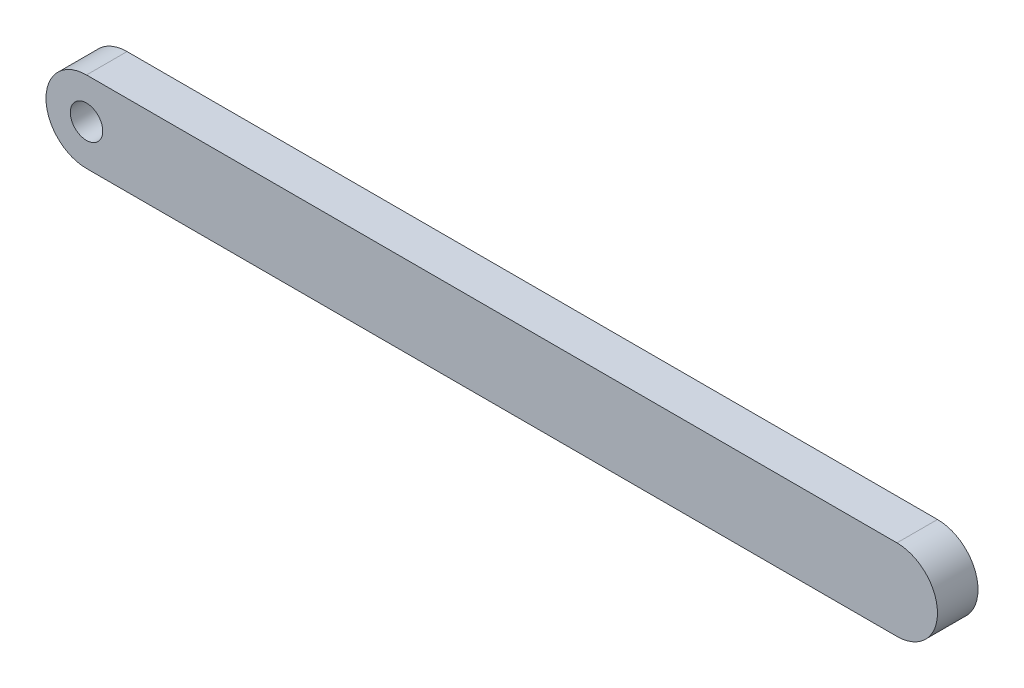
ISO-10303-21;
HEADER;
FILE_DESCRIPTION(('STEP AP214'),'2;1');
FILE_NAME('part.step','',(''),(''),'','','');
FILE_SCHEMA(('AUTOMOTIVE_DESIGN { 1 0 10303 214 1 1 1 1 }'));
ENDSEC;
DATA;
#1=APPLICATION_CONTEXT('core data for automotive mechanical design processes');
#2=APPLICATION_PROTOCOL_DEFINITION('international standard','automotive_design',2000,#1);
#3=PRODUCT_CONTEXT('',#1,'mechanical');
#4=PRODUCT('Part','Part','',(#3));
#5=PRODUCT_RELATED_PRODUCT_CATEGORY('part','',(#4));
#6=PRODUCT_DEFINITION_FORMATION('','',#4);
#7=PRODUCT_DEFINITION_CONTEXT('part definition',#1,'design');
#8=PRODUCT_DEFINITION('design','',#6,#7);
#9=PRODUCT_DEFINITION_SHAPE('','',#8);
#10=(LENGTH_UNIT() NAMED_UNIT(*) SI_UNIT(.MILLI.,.METRE.));
#11=(NAMED_UNIT(*) PLANE_ANGLE_UNIT() SI_UNIT($,.RADIAN.));
#12=(NAMED_UNIT(*) SI_UNIT($,.STERADIAN.) SOLID_ANGLE_UNIT());
#13=UNCERTAINTY_MEASURE_WITH_UNIT(LENGTH_MEASURE(1.E-05),#10,'distance_accuracy_value','');
#14=(GEOMETRIC_REPRESENTATION_CONTEXT(3) GLOBAL_UNCERTAINTY_ASSIGNED_CONTEXT((#13)) GLOBAL_UNIT_ASSIGNED_CONTEXT((#10,
#11,#12)) REPRESENTATION_CONTEXT('',''));
#15=CARTESIAN_POINT('',(0.,0.,0.));
#16=DIRECTION('',(0.,0.,1.));
#17=DIRECTION('',(1.,0.,0.));
#18=AXIS2_PLACEMENT_3D('',#15,#16,#17);
#19=CARTESIAN_POINT('',(0.,-5.00000000000002,5.));
#20=DIRECTION('',(0.,0.,-1.));
#21=DIRECTION('',(-1.,0.,0.));
#22=AXIS2_PLACEMENT_3D('',#19,#20,#21);
#23=CYLINDRICAL_SURFACE('',#22,5.);
#24=CARTESIAN_POINT('',(0.,-5.00000000000002,0.));
#25=DIRECTION('',(0.,0.,1.));
#26=DIRECTION('',(1.,0.,0.));
#27=AXIS2_PLACEMENT_3D('',#24,#25,#26);
#28=CIRCLE('',#27,5.);
#29=CARTESIAN_POINT('',(0.,0.,0.));
#30=VERTEX_POINT('',#29);
#31=CARTESIAN_POINT('',(0.,-10.,0.));
#32=VERTEX_POINT('',#31);
#33=EDGE_CURVE('E97',#30,#32,#28,.T.);
#34=ORIENTED_EDGE('',*,*,#33,.T.);
#35=DIRECTION('',(0.,0.,-1.));
#36=VECTOR('',#35,1.);
#37=CARTESIAN_POINT('',(0.,-10.,5.));
#38=LINE('',#37,#36);
#39=CARTESIAN_POINT('',(0.,-10.,5.));
#40=VERTEX_POINT('',#39);
#41=EDGE_CURVE('E11',#40,#32,#38,.T.);
#42=ORIENTED_EDGE('',*,*,#41,.F.);
#43=CARTESIAN_POINT('',(0.,-5.00000000000002,5.));
#44=DIRECTION('',(0.,0.,1.));
#45=DIRECTION('',(1.,0.,0.));
#46=AXIS2_PLACEMENT_3D('',#43,#44,#45);
#47=CIRCLE('',#46,5.);
#48=CARTESIAN_POINT('',(0.,0.,5.));
#49=VERTEX_POINT('',#48);
#50=EDGE_CURVE('E83',#49,#40,#47,.T.);
#51=ORIENTED_EDGE('',*,*,#50,.F.);
#52=DIRECTION('',(0.,0.,-1.));
#53=VECTOR('',#52,1.);
#54=CARTESIAN_POINT('',(0.,0.,5.));
#55=LINE('',#54,#53);
#56=EDGE_CURVE('E50',#49,#30,#55,.T.);
#57=ORIENTED_EDGE('',*,*,#56,.T.);
#58=EDGE_LOOP('',(#34,#42,#51,#57));
#59=FACE_BOUND('',#58,.T.);
#60=ADVANCED_FACE('F34',(#59),#23,.T.);
#61=CARTESIAN_POINT('',(0.,-10.,5.));
#62=DIRECTION('',(0.,1.,0.));
#63=DIRECTION('',(-1.,0.,0.));
#64=AXIS2_PLACEMENT_3D('',#61,#62,#63);
#65=PLANE('',#64);
#66=DIRECTION('',(1.,0.,0.));
#67=VECTOR('',#66,1.);
#68=CARTESIAN_POINT('',(0.,-10.,0.));
#69=LINE('',#68,#67);
#70=CARTESIAN_POINT('',(100.,-9.99999999999999,0.));
#71=VERTEX_POINT('',#70);
#72=EDGE_CURVE('E88',#32,#71,#69,.T.);
#73=ORIENTED_EDGE('',*,*,#72,.T.);
#74=DIRECTION('',(0.,0.,-1.));
#75=VECTOR('',#74,1.);
#76=CARTESIAN_POINT('',(100.,-9.99999999999999,5.));
#77=LINE('',#76,#75);
#78=CARTESIAN_POINT('',(100.,-9.99999999999999,5.));
#79=VERTEX_POINT('',#78);
#80=EDGE_CURVE('E42',#79,#71,#77,.T.);
#81=ORIENTED_EDGE('',*,*,#80,.F.);
#82=DIRECTION('',(1.,0.,0.));
#83=VECTOR('',#82,1.);
#84=CARTESIAN_POINT('',(0.,-10.,5.));
#85=LINE('',#84,#83);
#86=EDGE_CURVE('E75',#40,#79,#85,.T.);
#87=ORIENTED_EDGE('',*,*,#86,.F.);
#88=ORIENTED_EDGE('',*,*,#41,.T.);
#89=EDGE_LOOP('',(#73,#81,#87,#88));
#90=FACE_BOUND('',#89,.T.);
#91=ADVANCED_FACE('F87',(#90),#65,.F.);
#92=CARTESIAN_POINT('',(100.,-4.99999999999999,5.));
#93=DIRECTION('',(0.,0.,-1.));
#94=DIRECTION('',(-1.,0.,0.));
#95=AXIS2_PLACEMENT_3D('',#92,#93,#94);
#96=CYLINDRICAL_SURFACE('',#95,4.99999999999999);
#97=CARTESIAN_POINT('',(100.,-4.99999999999999,0.));
#98=DIRECTION('',(0.,0.,1.));
#99=DIRECTION('',(1.,0.,0.));
#100=AXIS2_PLACEMENT_3D('',#97,#98,#99);
#101=CIRCLE('',#100,4.99999999999999);
#102=CARTESIAN_POINT('',(100.,0.,0.));
#103=VERTEX_POINT('',#102);
#104=EDGE_CURVE('E101',#103,#71,#101,.F.);
#105=ORIENTED_EDGE('',*,*,#104,.F.);
#106=DIRECTION('',(0.,0.,-1.));
#107=VECTOR('',#106,1.);
#108=CARTESIAN_POINT('',(100.,0.,5.));
#109=LINE('',#108,#107);
#110=CARTESIAN_POINT('',(100.,0.,5.));
#111=VERTEX_POINT('',#110);
#112=EDGE_CURVE('E64',#111,#103,#109,.T.);
#113=ORIENTED_EDGE('',*,*,#112,.F.);
#114=CARTESIAN_POINT('',(100.,-4.99999999999999,5.));
#115=DIRECTION('',(0.,0.,1.));
#116=DIRECTION('',(1.,0.,0.));
#117=AXIS2_PLACEMENT_3D('',#114,#115,#116);
#118=CIRCLE('',#117,4.99999999999999);
#119=EDGE_CURVE('E82',#111,#79,#118,.F.);
#120=ORIENTED_EDGE('',*,*,#119,.T.);
#121=ORIENTED_EDGE('',*,*,#80,.T.);
#122=EDGE_LOOP('',(#105,#113,#120,#121));
#123=FACE_BOUND('',#122,.T.);
#124=ADVANCED_FACE('F91',(#123),#96,.T.);
#125=CARTESIAN_POINT('',(0.,0.,5.));
#126=DIRECTION('',(0.,1.,0.));
#127=DIRECTION('',(0.,0.,1.));
#128=AXIS2_PLACEMENT_3D('',#125,#126,#127);
#129=PLANE('',#128);
#130=DIRECTION('',(1.,0.,0.));
#131=VECTOR('',#130,1.);
#132=CARTESIAN_POINT('',(0.,0.,0.));
#133=LINE('',#132,#131);
#134=EDGE_CURVE('E103',#30,#103,#133,.T.);
#135=ORIENTED_EDGE('',*,*,#134,.F.);
#136=ORIENTED_EDGE('',*,*,#56,.F.);
#137=DIRECTION('',(1.,0.,0.));
#138=VECTOR('',#137,1.);
#139=CARTESIAN_POINT('',(0.,0.,5.));
#140=LINE('',#139,#138);
#141=EDGE_CURVE('E92',#49,#111,#140,.T.);
#142=ORIENTED_EDGE('',*,*,#141,.T.);
#143=ORIENTED_EDGE('',*,*,#112,.T.);
#144=EDGE_LOOP('',(#135,#136,#142,#143));
#145=FACE_BOUND('',#144,.T.);
#146=ADVANCED_FACE('F124',(#145),#129,.T.);
#147=CARTESIAN_POINT('',(0.,0.,5.));
#148=DIRECTION('',(0.,0.,1.));
#149=DIRECTION('',(1.,0.,0.));
#150=AXIS2_PLACEMENT_3D('',#147,#148,#149);
#151=PLANE('',#150);
#152=CARTESIAN_POINT('',(0.,-5.00000000000002,5.));
#153=DIRECTION('',(0.,0.,1.));
#154=DIRECTION('',(1.,0.,0.));
#155=AXIS2_PLACEMENT_3D('',#152,#153,#154);
#156=CIRCLE('',#155,2.);
#157=CARTESIAN_POINT('',(2.,-5.00000000000002,5.));
#158=VERTEX_POINT('',#157);
#159=EDGE_CURVE('E109',#158,#158,#156,.T.);
#160=ORIENTED_EDGE('',*,*,#159,.F.);
#161=EDGE_LOOP('',(#160));
#162=FACE_BOUND('',#161,.T.);
#163=ORIENTED_EDGE('',*,*,#50,.T.);
#164=ORIENTED_EDGE('',*,*,#86,.T.);
#165=ORIENTED_EDGE('',*,*,#119,.F.);
#166=ORIENTED_EDGE('',*,*,#141,.F.);
#167=EDGE_LOOP('',(#163,#164,#165,#166));
#168=FACE_BOUND('',#167,.T.);
#169=ADVANCED_FACE('F79',(#162,#168),#151,.T.);
#170=CARTESIAN_POINT('',(0.,0.,0.));
#171=DIRECTION('',(0.,0.,1.));
#172=DIRECTION('',(1.,0.,0.));
#173=AXIS2_PLACEMENT_3D('',#170,#171,#172);
#174=PLANE('',#173);
#175=CARTESIAN_POINT('',(0.,-5.00000000000002,0.));
#176=DIRECTION('',(0.,0.,1.));
#177=DIRECTION('',(1.,0.,0.));
#178=AXIS2_PLACEMENT_3D('',#175,#176,#177);
#179=CIRCLE('',#178,2.);
#180=CARTESIAN_POINT('',(2.,-5.00000000000002,0.));
#181=VERTEX_POINT('',#180);
#182=EDGE_CURVE('E99',#181,#181,#179,.T.);
#183=ORIENTED_EDGE('',*,*,#182,.T.);
#184=EDGE_LOOP('',(#183));
#185=FACE_BOUND('',#184,.T.);
#186=ORIENTED_EDGE('',*,*,#33,.F.);
#187=ORIENTED_EDGE('',*,*,#134,.T.);
#188=ORIENTED_EDGE('',*,*,#104,.T.);
#189=ORIENTED_EDGE('',*,*,#72,.F.);
#190=EDGE_LOOP('',(#186,#187,#188,#189));
#191=FACE_BOUND('',#190,.T.);
#192=ADVANCED_FACE('F115',(#185,#191),#174,.F.);
#193=CARTESIAN_POINT('',(0.,-5.00000000000002,0.));
#194=DIRECTION('',(0.,0.,1.));
#195=DIRECTION('',(1.,0.,0.));
#196=AXIS2_PLACEMENT_3D('',#193,#194,#195);
#197=CYLINDRICAL_SURFACE('',#196,2.);
#198=ORIENTED_EDGE('',*,*,#182,.F.);
#199=EDGE_LOOP('',(#198));
#200=FACE_BOUND('',#199,.T.);
#201=ORIENTED_EDGE('',*,*,#159,.T.);
#202=EDGE_LOOP('',(#201));
#203=FACE_BOUND('',#202,.T.);
#204=ADVANCED_FACE('F117',(#200,#203),#197,.F.);
#205=CLOSED_SHELL('',(#60,#91,#124,#146,#169,#192,#204));
#206=MANIFOLD_SOLID_BREP('B2',#205);
#207=ADVANCED_BREP_SHAPE_REPRESENTATION('',(#18,#206),#14);
#208=SHAPE_DEFINITION_REPRESENTATION(#9,#207);
ENDSEC;
END-ISO-10303-21;
